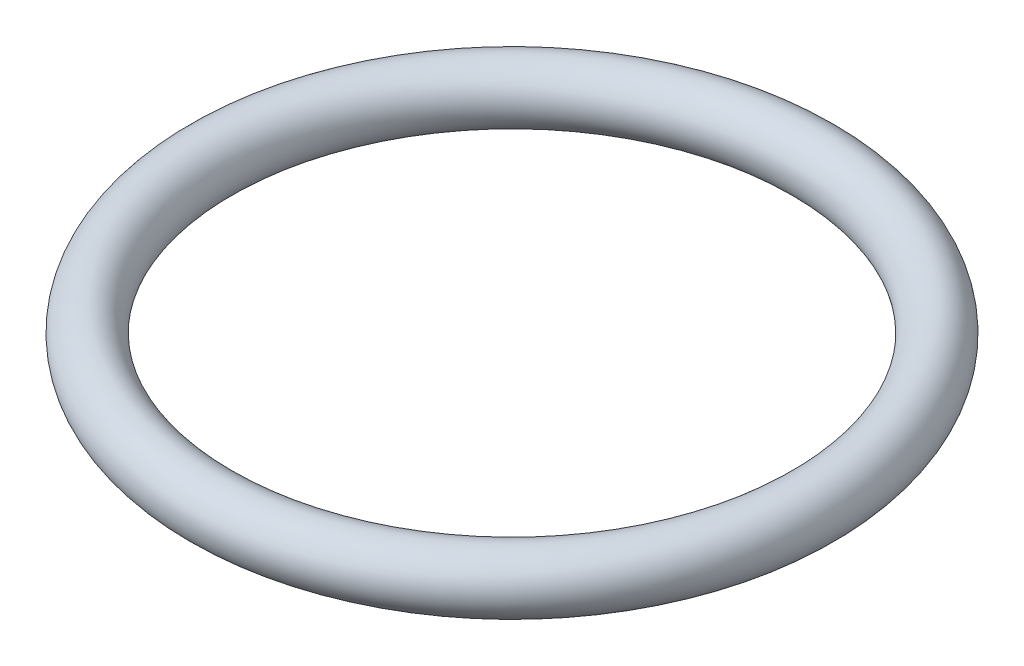
ISO-10303-21;
HEADER;
FILE_DESCRIPTION(('STEP AP214'),'2;1');
FILE_NAME('part.step','',(''),(''),'','','');
FILE_SCHEMA(('AUTOMOTIVE_DESIGN { 1 0 10303 214 1 1 1 1 }'));
ENDSEC;
DATA;
#1=APPLICATION_CONTEXT('core data for automotive mechanical design processes');
#2=APPLICATION_PROTOCOL_DEFINITION('international standard','automotive_design',2000,#1);
#3=PRODUCT_CONTEXT('',#1,'mechanical');
#4=PRODUCT('Part','Part','',(#3));
#5=PRODUCT_RELATED_PRODUCT_CATEGORY('part','',(#4));
#6=PRODUCT_DEFINITION_FORMATION('','',#4);
#7=PRODUCT_DEFINITION_CONTEXT('part definition',#1,'design');
#8=PRODUCT_DEFINITION('design','',#6,#7);
#9=PRODUCT_DEFINITION_SHAPE('','',#8);
#10=(LENGTH_UNIT() NAMED_UNIT(*) SI_UNIT(.MILLI.,.METRE.));
#11=(NAMED_UNIT(*) PLANE_ANGLE_UNIT() SI_UNIT($,.RADIAN.));
#12=(NAMED_UNIT(*) SI_UNIT($,.STERADIAN.) SOLID_ANGLE_UNIT());
#13=UNCERTAINTY_MEASURE_WITH_UNIT(LENGTH_MEASURE(1.E-05),#10,'distance_accuracy_value','');
#14=(GEOMETRIC_REPRESENTATION_CONTEXT(3) GLOBAL_UNCERTAINTY_ASSIGNED_CONTEXT((#13)) GLOBAL_UNIT_ASSIGNED_CONTEXT((#10,
#11,#12)) REPRESENTATION_CONTEXT('',''));
#15=CARTESIAN_POINT('',(0.,0.,0.));
#16=DIRECTION('',(0.,0.,1.));
#17=DIRECTION('',(1.,0.,0.));
#18=AXIS2_PLACEMENT_3D('',#15,#16,#17);
#19=CARTESIAN_POINT('',(0.,0.,0.));
#20=DIRECTION('',(0.,1.,0.));
#21=DIRECTION('',(0.,0.,1.));
#22=AXIS2_PLACEMENT_3D('',#19,#20,#21);
#23=TOROIDAL_SURFACE('',#22,18.225,1.765);
#24=CARTESIAN_POINT('',(0.,0.,19.99));
#25=VERTEX_POINT('',#24);
#26=VERTEX_LOOP('',#25);
#27=FACE_BOUND('',#26,.T.);
#28=ADVANCED_FACE('F35',(#27),#23,.T.);
#29=CLOSED_SHELL('',(#28));
#30=MANIFOLD_SOLID_BREP('B2',#29);
#31=ADVANCED_BREP_SHAPE_REPRESENTATION('',(#18,#30),#14);
#32=SHAPE_DEFINITION_REPRESENTATION(#9,#31);
ENDSEC;
END-ISO-10303-21;
